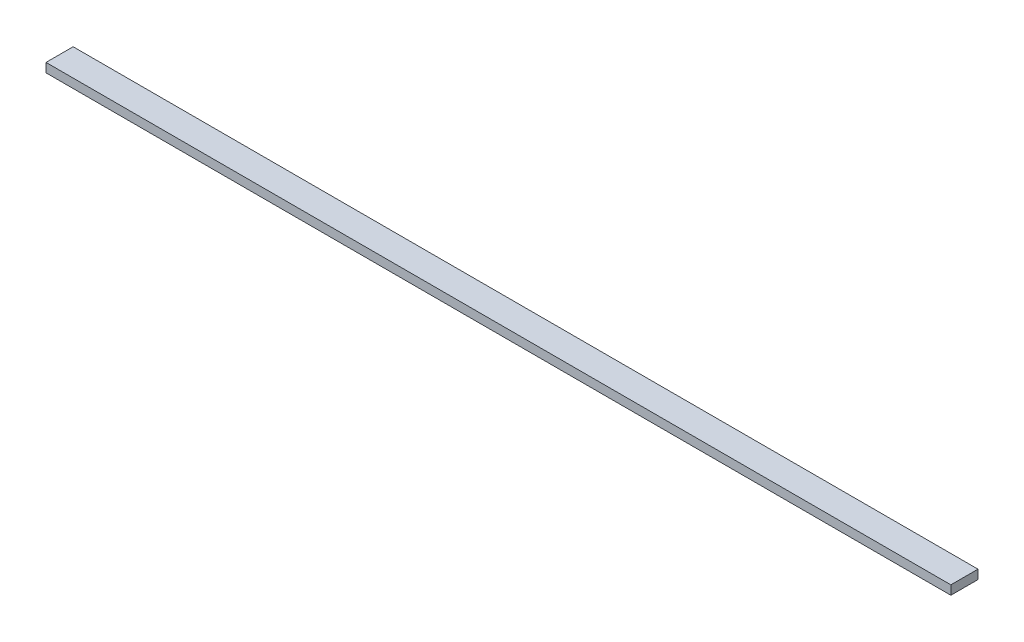
ISO-10303-21;
HEADER;
FILE_DESCRIPTION(('STEP AP214'),'2;1');
FILE_NAME('part.step','',(''),(''),'','','');
FILE_SCHEMA(('AUTOMOTIVE_DESIGN { 1 0 10303 214 1 1 1 1 }'));
ENDSEC;
DATA;
#1=APPLICATION_CONTEXT('core data for automotive mechanical design processes');
#2=APPLICATION_PROTOCOL_DEFINITION('international standard','automotive_design',2000,#1);
#3=PRODUCT_CONTEXT('',#1,'mechanical');
#4=PRODUCT('Part','Part','',(#3));
#5=PRODUCT_RELATED_PRODUCT_CATEGORY('part','',(#4));
#6=PRODUCT_DEFINITION_FORMATION('','',#4);
#7=PRODUCT_DEFINITION_CONTEXT('part definition',#1,'design');
#8=PRODUCT_DEFINITION('design','',#6,#7);
#9=PRODUCT_DEFINITION_SHAPE('','',#8);
#10=(LENGTH_UNIT() NAMED_UNIT(*) SI_UNIT(.MILLI.,.METRE.));
#11=(NAMED_UNIT(*) PLANE_ANGLE_UNIT() SI_UNIT($,.RADIAN.));
#12=(NAMED_UNIT(*) SI_UNIT($,.STERADIAN.) SOLID_ANGLE_UNIT());
#13=UNCERTAINTY_MEASURE_WITH_UNIT(LENGTH_MEASURE(1.E-05),#10,'distance_accuracy_value','');
#14=(GEOMETRIC_REPRESENTATION_CONTEXT(3) GLOBAL_UNCERTAINTY_ASSIGNED_CONTEXT((#13)) GLOBAL_UNIT_ASSIGNED_CONTEXT((#10,
#11,#12)) REPRESENTATION_CONTEXT('',''));
#15=CARTESIAN_POINT('',(0.,0.,0.));
#16=DIRECTION('',(0.,0.,1.));
#17=DIRECTION('',(1.,0.,0.));
#18=AXIS2_PLACEMENT_3D('',#15,#16,#17);
#19=CARTESIAN_POINT('',(-60.6802721088435,6.,0.367346938775506));
#20=DIRECTION('',(1.,0.,0.));
#21=DIRECTION('',(0.,0.,-1.));
#22=AXIS2_PLACEMENT_3D('',#19,#20,#21);
#23=PLANE('',#22);
#24=DIRECTION('',(0.,0.,1.));
#25=VECTOR('',#24,1.);
#26=CARTESIAN_POINT('',(-60.6802721088435,0.,0.367346938775506));
#27=LINE('',#26,#25);
#28=CARTESIAN_POINT('',(-60.6802721088435,0.,0.367346938775506));
#29=VERTEX_POINT('',#28);
#30=CARTESIAN_POINT('',(-60.6802721088435,0.,18.3673469387755));
#31=VERTEX_POINT('',#30);
#32=EDGE_CURVE('E107',#29,#31,#27,.T.);
#33=ORIENTED_EDGE('',*,*,#32,.T.);
#34=DIRECTION('',(0.,-1.,0.));
#35=VECTOR('',#34,1.);
#36=CARTESIAN_POINT('',(-60.6802721088435,6.,18.3673469387755));
#37=LINE('',#36,#35);
#38=CARTESIAN_POINT('',(-60.6802721088435,6.,18.3673469387755));
#39=VERTEX_POINT('',#38);
#40=EDGE_CURVE('E11',#39,#31,#37,.T.);
#41=ORIENTED_EDGE('',*,*,#40,.F.);
#42=DIRECTION('',(0.,0.,1.));
#43=VECTOR('',#42,1.);
#44=CARTESIAN_POINT('',(-60.6802721088435,6.,0.367346938775506));
#45=LINE('',#44,#43);
#46=CARTESIAN_POINT('',(-60.6802721088435,6.,0.367346938775506));
#47=VERTEX_POINT('',#46);
#48=EDGE_CURVE('E91',#47,#39,#45,.T.);
#49=ORIENTED_EDGE('',*,*,#48,.F.);
#50=DIRECTION('',(0.,-1.,0.));
#51=VECTOR('',#50,1.);
#52=CARTESIAN_POINT('',(-60.6802721088435,6.,0.367346938775506));
#53=LINE('',#52,#51);
#54=EDGE_CURVE('E103',#47,#29,#53,.T.);
#55=ORIENTED_EDGE('',*,*,#54,.T.);
#56=EDGE_LOOP('',(#33,#41,#49,#55));
#57=FACE_BOUND('',#56,.T.);
#58=ADVANCED_FACE('F39',(#57),#23,.F.);
#59=CARTESIAN_POINT('',(-60.6802721088435,6.,18.3673469387755));
#60=DIRECTION('',(0.,0.,-1.));
#61=DIRECTION('',(-1.,0.,0.));
#62=AXIS2_PLACEMENT_3D('',#59,#60,#61);
#63=PLANE('',#62);
#64=DIRECTION('',(1.,0.,0.));
#65=VECTOR('',#64,1.);
#66=CARTESIAN_POINT('',(-60.6802721088435,0.,18.3673469387755));
#67=LINE('',#66,#65);
#68=CARTESIAN_POINT('',(539.319727891157,0.,18.3673469387755));
#69=VERTEX_POINT('',#68);
#70=EDGE_CURVE('E96',#31,#69,#67,.T.);
#71=ORIENTED_EDGE('',*,*,#70,.T.);
#72=DIRECTION('',(0.,-1.,0.));
#73=VECTOR('',#72,1.);
#74=CARTESIAN_POINT('',(539.319727891157,6.,18.3673469387755));
#75=LINE('',#74,#73);
#76=CARTESIAN_POINT('',(539.319727891157,6.,18.3673469387755));
#77=VERTEX_POINT('',#76);
#78=EDGE_CURVE('E48',#77,#69,#75,.T.);
#79=ORIENTED_EDGE('',*,*,#78,.F.);
#80=DIRECTION('',(1.,0.,0.));
#81=VECTOR('',#80,1.);
#82=CARTESIAN_POINT('',(-60.6802721088435,6.,18.3673469387755));
#83=LINE('',#82,#81);
#84=EDGE_CURVE('E86',#39,#77,#83,.T.);
#85=ORIENTED_EDGE('',*,*,#84,.F.);
#86=ORIENTED_EDGE('',*,*,#40,.T.);
#87=EDGE_LOOP('',(#71,#79,#85,#86));
#88=FACE_BOUND('',#87,.T.);
#89=ADVANCED_FACE('F95',(#88),#63,.F.);
#90=CARTESIAN_POINT('',(539.319727891157,6.,0.367346938775506));
#91=DIRECTION('',(-1.,0.,0.));
#92=DIRECTION('',(0.,0.,1.));
#93=AXIS2_PLACEMENT_3D('',#90,#91,#92);
#94=PLANE('',#93);
#95=DIRECTION('',(0.,0.,-1.));
#96=VECTOR('',#95,1.);
#97=CARTESIAN_POINT('',(539.319727891157,0.,0.367346938775506));
#98=LINE('',#97,#96);
#99=CARTESIAN_POINT('',(539.319727891157,0.,0.367346938775506));
#100=VERTEX_POINT('',#99);
#101=EDGE_CURVE('E73',#69,#100,#98,.T.);
#102=ORIENTED_EDGE('',*,*,#101,.T.);
#103=DIRECTION('',(0.,-1.,0.));
#104=VECTOR('',#103,1.);
#105=CARTESIAN_POINT('',(539.319727891157,6.,0.367346938775506));
#106=LINE('',#105,#104);
#107=CARTESIAN_POINT('',(539.319727891157,6.,0.367346938775506));
#108=VERTEX_POINT('',#107);
#109=EDGE_CURVE('E98',#108,#100,#106,.T.);
#110=ORIENTED_EDGE('',*,*,#109,.F.);
#111=DIRECTION('',(0.,0.,-1.));
#112=VECTOR('',#111,1.);
#113=CARTESIAN_POINT('',(539.319727891157,6.,0.367346938775506));
#114=LINE('',#113,#112);
#115=EDGE_CURVE('E89',#77,#108,#114,.T.);
#116=ORIENTED_EDGE('',*,*,#115,.F.);
#117=ORIENTED_EDGE('',*,*,#78,.T.);
#118=EDGE_LOOP('',(#102,#110,#116,#117));
#119=FACE_BOUND('',#118,.T.);
#120=ADVANCED_FACE('F99',(#119),#94,.F.);
#121=CARTESIAN_POINT('',(-60.6802721088435,6.,0.367346938775506));
#122=DIRECTION('',(0.,0.,1.));
#123=DIRECTION('',(1.,0.,0.));
#124=AXIS2_PLACEMENT_3D('',#121,#122,#123);
#125=PLANE('',#124);
#126=DIRECTION('',(-1.,0.,0.));
#127=VECTOR('',#126,1.);
#128=CARTESIAN_POINT('',(-60.6802721088435,0.,0.367346938775506));
#129=LINE('',#128,#127);
#130=EDGE_CURVE('E79',#100,#29,#129,.T.);
#131=ORIENTED_EDGE('',*,*,#130,.T.);
#132=ORIENTED_EDGE('',*,*,#54,.F.);
#133=DIRECTION('',(-1.,0.,0.));
#134=VECTOR('',#133,1.);
#135=CARTESIAN_POINT('',(-60.6802721088435,6.,0.367346938775506));
#136=LINE('',#135,#134);
#137=EDGE_CURVE('E56',#108,#47,#136,.T.);
#138=ORIENTED_EDGE('',*,*,#137,.F.);
#139=ORIENTED_EDGE('',*,*,#109,.T.);
#140=EDGE_LOOP('',(#131,#132,#138,#139));
#141=FACE_BOUND('',#140,.T.);
#142=ADVANCED_FACE('F120',(#141),#125,.F.);
#143=CARTESIAN_POINT('',(0.,6.,0.));
#144=DIRECTION('',(0.,1.,0.));
#145=DIRECTION('',(0.,0.,1.));
#146=AXIS2_PLACEMENT_3D('',#143,#144,#145);
#147=PLANE('',#146);
#148=ORIENTED_EDGE('',*,*,#48,.T.);
#149=ORIENTED_EDGE('',*,*,#84,.T.);
#150=ORIENTED_EDGE('',*,*,#115,.T.);
#151=ORIENTED_EDGE('',*,*,#137,.T.);
#152=EDGE_LOOP('',(#148,#149,#150,#151));
#153=FACE_BOUND('',#152,.T.);
#154=ADVANCED_FACE('F87',(#153),#147,.T.);
#155=CARTESIAN_POINT('',(0.,0.,0.));
#156=DIRECTION('',(0.,1.,0.));
#157=DIRECTION('',(0.,0.,1.));
#158=AXIS2_PLACEMENT_3D('',#155,#156,#157);
#159=PLANE('',#158);
#160=ORIENTED_EDGE('',*,*,#32,.F.);
#161=ORIENTED_EDGE('',*,*,#130,.F.);
#162=ORIENTED_EDGE('',*,*,#101,.F.);
#163=ORIENTED_EDGE('',*,*,#70,.F.);
#164=EDGE_LOOP('',(#160,#161,#162,#163));
#165=FACE_BOUND('',#164,.T.);
#166=ADVANCED_FACE('F123',(#165),#159,.F.);
#167=CLOSED_SHELL('',(#58,#89,#120,#142,#154,#166));
#168=MANIFOLD_SOLID_BREP('B2',#167);
#169=ADVANCED_BREP_SHAPE_REPRESENTATION('',(#18,#168),#14);
#170=SHAPE_DEFINITION_REPRESENTATION(#9,#169);
ENDSEC;
END-ISO-10303-21;
